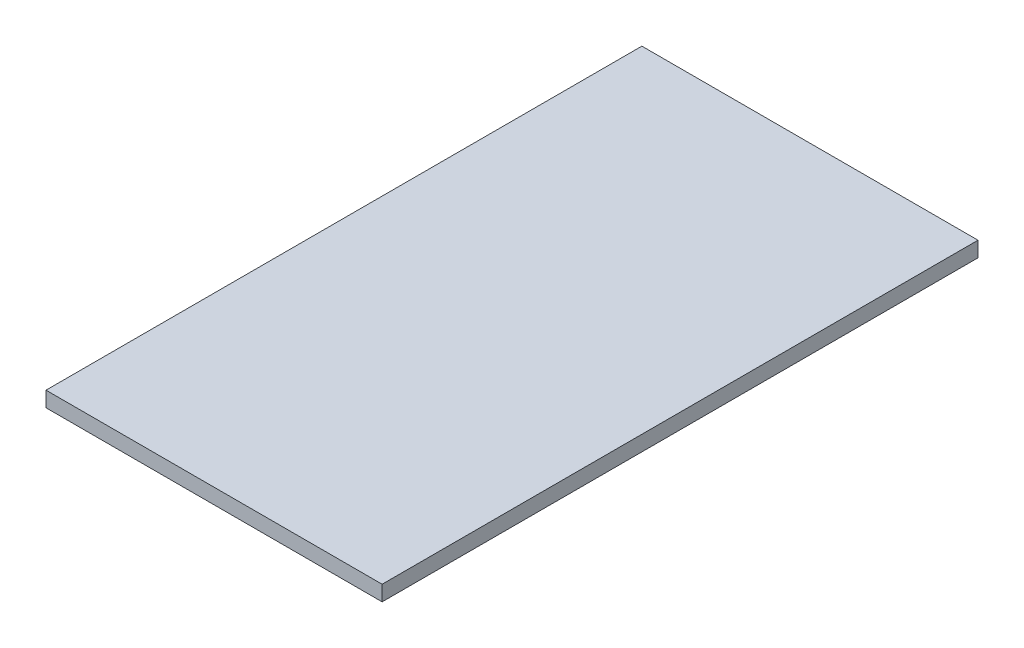
ISO-10303-21;
HEADER;
FILE_DESCRIPTION(('STEP AP214'),'2;1');
FILE_NAME('part.step','',(''),(''),'','','');
FILE_SCHEMA(('AUTOMOTIVE_DESIGN { 1 0 10303 214 1 1 1 1 }'));
ENDSEC;
DATA;
#1=APPLICATION_CONTEXT('core data for automotive mechanical design processes');
#2=APPLICATION_PROTOCOL_DEFINITION('international standard','automotive_design',2000,#1);
#3=PRODUCT_CONTEXT('',#1,'mechanical');
#4=PRODUCT('Part','Part','',(#3));
#5=PRODUCT_RELATED_PRODUCT_CATEGORY('part','',(#4));
#6=PRODUCT_DEFINITION_FORMATION('','',#4);
#7=PRODUCT_DEFINITION_CONTEXT('part definition',#1,'design');
#8=PRODUCT_DEFINITION('design','',#6,#7);
#9=PRODUCT_DEFINITION_SHAPE('','',#8);
#10=(LENGTH_UNIT() NAMED_UNIT(*) SI_UNIT(.MILLI.,.METRE.));
#11=(NAMED_UNIT(*) PLANE_ANGLE_UNIT() SI_UNIT($,.RADIAN.));
#12=(NAMED_UNIT(*) SI_UNIT($,.STERADIAN.) SOLID_ANGLE_UNIT());
#13=UNCERTAINTY_MEASURE_WITH_UNIT(LENGTH_MEASURE(1.E-05),#10,'distance_accuracy_value','');
#14=(GEOMETRIC_REPRESENTATION_CONTEXT(3) GLOBAL_UNCERTAINTY_ASSIGNED_CONTEXT((#13)) GLOBAL_UNIT_ASSIGNED_CONTEXT((#10,
#11,#12)) REPRESENTATION_CONTEXT('',''));
#15=CARTESIAN_POINT('',(0.,0.,0.));
#16=DIRECTION('',(0.,0.,1.));
#17=DIRECTION('',(1.,0.,0.));
#18=AXIS2_PLACEMENT_3D('',#15,#16,#17);
#19=CARTESIAN_POINT('',(1.1,0.1,-1.95));
#20=DIRECTION('',(-1.,0.,0.));
#21=DIRECTION('',(0.,0.,1.));
#22=AXIS2_PLACEMENT_3D('',#19,#20,#21);
#23=PLANE('',#22);
#24=DIRECTION('',(0.,0.,-1.));
#25=VECTOR('',#24,1.);
#26=CARTESIAN_POINT('',(1.1,0.,-1.95));
#27=LINE('',#26,#25);
#28=CARTESIAN_POINT('',(1.1,0.,1.95));
#29=VERTEX_POINT('',#28);
#30=CARTESIAN_POINT('',(1.1,0.,-1.95));
#31=VERTEX_POINT('',#30);
#32=EDGE_CURVE('E104',#29,#31,#27,.T.);
#33=ORIENTED_EDGE('',*,*,#32,.T.);
#34=DIRECTION('',(0.,-1.,0.));
#35=VECTOR('',#34,1.);
#36=CARTESIAN_POINT('',(1.1,0.1,-1.95));
#37=LINE('',#36,#35);
#38=CARTESIAN_POINT('',(1.1,0.1,-1.95));
#39=VERTEX_POINT('',#38);
#40=EDGE_CURVE('E11',#39,#31,#37,.T.);
#41=ORIENTED_EDGE('',*,*,#40,.F.);
#42=DIRECTION('',(0.,0.,-1.));
#43=VECTOR('',#42,1.);
#44=CARTESIAN_POINT('',(1.1,0.1,-1.95));
#45=LINE('',#44,#43);
#46=CARTESIAN_POINT('',(1.1,0.1,1.95));
#47=VERTEX_POINT('',#46);
#48=EDGE_CURVE('E92',#47,#39,#45,.T.);
#49=ORIENTED_EDGE('',*,*,#48,.F.);
#50=DIRECTION('',(0.,-1.,0.));
#51=VECTOR('',#50,1.);
#52=CARTESIAN_POINT('',(1.1,0.1,1.95));
#53=LINE('',#52,#51);
#54=EDGE_CURVE('E100',#47,#29,#53,.T.);
#55=ORIENTED_EDGE('',*,*,#54,.T.);
#56=EDGE_LOOP('',(#33,#41,#49,#55));
#57=FACE_BOUND('',#56,.T.);
#58=ADVANCED_FACE('F41',(#57),#23,.F.);
#59=CARTESIAN_POINT('',(-1.1,0.1,-1.95));
#60=DIRECTION('',(0.,0.,1.));
#61=DIRECTION('',(1.,0.,0.));
#62=AXIS2_PLACEMENT_3D('',#59,#60,#61);
#63=PLANE('',#62);
#64=DIRECTION('',(-1.,0.,0.));
#65=VECTOR('',#64,1.);
#66=CARTESIAN_POINT('',(-1.1,0.,-1.95));
#67=LINE('',#66,#65);
#68=CARTESIAN_POINT('',(-1.1,0.,-1.95));
#69=VERTEX_POINT('',#68);
#70=EDGE_CURVE('E96',#31,#69,#67,.T.);
#71=ORIENTED_EDGE('',*,*,#70,.T.);
#72=DIRECTION('',(0.,-1.,0.));
#73=VECTOR('',#72,1.);
#74=CARTESIAN_POINT('',(-1.1,0.1,-1.95));
#75=LINE('',#74,#73);
#76=CARTESIAN_POINT('',(-1.1,0.1,-1.95));
#77=VERTEX_POINT('',#76);
#78=EDGE_CURVE('E49',#77,#69,#75,.T.);
#79=ORIENTED_EDGE('',*,*,#78,.F.);
#80=DIRECTION('',(-1.,0.,0.));
#81=VECTOR('',#80,1.);
#82=CARTESIAN_POINT('',(-1.1,0.1,-1.95));
#83=LINE('',#82,#81);
#84=EDGE_CURVE('E87',#39,#77,#83,.T.);
#85=ORIENTED_EDGE('',*,*,#84,.F.);
#86=ORIENTED_EDGE('',*,*,#40,.T.);
#87=EDGE_LOOP('',(#71,#79,#85,#86));
#88=FACE_BOUND('',#87,.T.);
#89=ADVANCED_FACE('F95',(#88),#63,.F.);
#90=CARTESIAN_POINT('',(-1.1,0.1,-1.95));
#91=DIRECTION('',(1.,0.,0.));
#92=DIRECTION('',(0.,0.,-1.));
#93=AXIS2_PLACEMENT_3D('',#90,#91,#92);
#94=PLANE('',#93);
#95=DIRECTION('',(0.,0.,1.));
#96=VECTOR('',#95,1.);
#97=CARTESIAN_POINT('',(-1.1,0.,-1.95));
#98=LINE('',#97,#96);
#99=CARTESIAN_POINT('',(-1.1,0.,1.95));
#100=VERTEX_POINT('',#99);
#101=EDGE_CURVE('E74',#69,#100,#98,.T.);
#102=ORIENTED_EDGE('',*,*,#101,.T.);
#103=DIRECTION('',(0.,-1.,0.));
#104=VECTOR('',#103,1.);
#105=CARTESIAN_POINT('',(-1.1,0.1,1.95));
#106=LINE('',#105,#104);
#107=CARTESIAN_POINT('',(-1.1,0.1,1.95));
#108=VERTEX_POINT('',#107);
#109=EDGE_CURVE('E97',#108,#100,#106,.T.);
#110=ORIENTED_EDGE('',*,*,#109,.F.);
#111=DIRECTION('',(0.,0.,1.));
#112=VECTOR('',#111,1.);
#113=CARTESIAN_POINT('',(-1.1,0.1,-1.95));
#114=LINE('',#113,#112);
#115=EDGE_CURVE('E90',#77,#108,#114,.T.);
#116=ORIENTED_EDGE('',*,*,#115,.F.);
#117=ORIENTED_EDGE('',*,*,#78,.T.);
#118=EDGE_LOOP('',(#102,#110,#116,#117));
#119=FACE_BOUND('',#118,.T.);
#120=ADVANCED_FACE('F98',(#119),#94,.F.);
#121=CARTESIAN_POINT('',(-1.1,0.1,1.95));
#122=DIRECTION('',(0.,0.,-1.));
#123=DIRECTION('',(-1.,0.,0.));
#124=AXIS2_PLACEMENT_3D('',#121,#122,#123);
#125=PLANE('',#124);
#126=DIRECTION('',(1.,0.,0.));
#127=VECTOR('',#126,1.);
#128=CARTESIAN_POINT('',(-1.1,0.,1.95));
#129=LINE('',#128,#127);
#130=EDGE_CURVE('E80',#100,#29,#129,.T.);
#131=ORIENTED_EDGE('',*,*,#130,.T.);
#132=ORIENTED_EDGE('',*,*,#54,.F.);
#133=DIRECTION('',(1.,0.,0.));
#134=VECTOR('',#133,1.);
#135=CARTESIAN_POINT('',(-1.1,0.1,1.95));
#136=LINE('',#135,#134);
#137=EDGE_CURVE('E57',#108,#47,#136,.T.);
#138=ORIENTED_EDGE('',*,*,#137,.F.);
#139=ORIENTED_EDGE('',*,*,#109,.T.);
#140=EDGE_LOOP('',(#131,#132,#138,#139));
#141=FACE_BOUND('',#140,.T.);
#142=ADVANCED_FACE('F111',(#141),#125,.F.);
#143=CARTESIAN_POINT('',(0.,0.1,0.));
#144=DIRECTION('',(0.,1.,0.));
#145=DIRECTION('',(0.,0.,1.));
#146=AXIS2_PLACEMENT_3D('',#143,#144,#145);
#147=PLANE('',#146);
#148=ORIENTED_EDGE('',*,*,#48,.T.);
#149=ORIENTED_EDGE('',*,*,#84,.T.);
#150=ORIENTED_EDGE('',*,*,#115,.T.);
#151=ORIENTED_EDGE('',*,*,#137,.T.);
#152=EDGE_LOOP('',(#148,#149,#150,#151));
#153=FACE_BOUND('',#152,.T.);
#154=ADVANCED_FACE('F88',(#153),#147,.T.);
#155=CARTESIAN_POINT('',(0.,0.,0.));
#156=DIRECTION('',(0.,1.,0.));
#157=DIRECTION('',(0.,0.,1.));
#158=AXIS2_PLACEMENT_3D('',#155,#156,#157);
#159=PLANE('',#158);
#160=ORIENTED_EDGE('',*,*,#32,.F.);
#161=ORIENTED_EDGE('',*,*,#130,.F.);
#162=ORIENTED_EDGE('',*,*,#101,.F.);
#163=ORIENTED_EDGE('',*,*,#70,.F.);
#164=EDGE_LOOP('',(#160,#161,#162,#163));
#165=FACE_BOUND('',#164,.T.);
#166=ADVANCED_FACE('F114',(#165),#159,.F.);
#167=CLOSED_SHELL('',(#58,#89,#120,#142,#154,#166));
#168=MANIFOLD_SOLID_BREP('B2',#167);
#169=ADVANCED_BREP_SHAPE_REPRESENTATION('',(#18,#168),#14);
#170=SHAPE_DEFINITION_REPRESENTATION(#9,#169);
ENDSEC;
END-ISO-10303-21;
